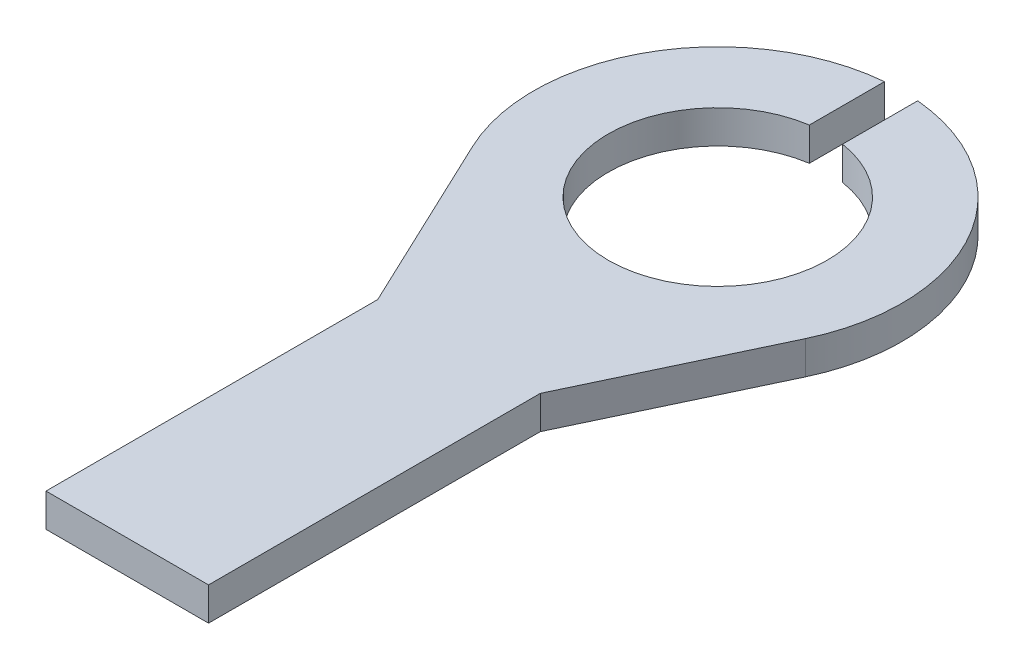
ISO-10303-21;
HEADER;
FILE_DESCRIPTION(('STEP AP214'),'2;1');
FILE_NAME('part.step','',(''),(''),'','','');
FILE_SCHEMA(('AUTOMOTIVE_DESIGN { 1 0 10303 214 1 1 1 1 }'));
ENDSEC;
DATA;
#1=APPLICATION_CONTEXT('core data for automotive mechanical design processes');
#2=APPLICATION_PROTOCOL_DEFINITION('international standard','automotive_design',2000,#1);
#3=PRODUCT_CONTEXT('',#1,'mechanical');
#4=PRODUCT('Part','Part','',(#3));
#5=PRODUCT_RELATED_PRODUCT_CATEGORY('part','',(#4));
#6=PRODUCT_DEFINITION_FORMATION('','',#4);
#7=PRODUCT_DEFINITION_CONTEXT('part definition',#1,'design');
#8=PRODUCT_DEFINITION('design','',#6,#7);
#9=PRODUCT_DEFINITION_SHAPE('','',#8);
#10=(LENGTH_UNIT() NAMED_UNIT(*) SI_UNIT(.MILLI.,.METRE.));
#11=(NAMED_UNIT(*) PLANE_ANGLE_UNIT() SI_UNIT($,.RADIAN.));
#12=(NAMED_UNIT(*) SI_UNIT($,.STERADIAN.) SOLID_ANGLE_UNIT());
#13=UNCERTAINTY_MEASURE_WITH_UNIT(LENGTH_MEASURE(1.E-05),#10,'distance_accuracy_value','');
#14=(GEOMETRIC_REPRESENTATION_CONTEXT(3) GLOBAL_UNCERTAINTY_ASSIGNED_CONTEXT((#13)) GLOBAL_UNIT_ASSIGNED_CONTEXT((#10,
#11,#12)) REPRESENTATION_CONTEXT('',''));
#15=CARTESIAN_POINT('',(0.,0.,0.));
#16=DIRECTION('',(0.,0.,1.));
#17=DIRECTION('',(1.,0.,0.));
#18=AXIS2_PLACEMENT_3D('',#15,#16,#17);
#19=CARTESIAN_POINT('',(-1.27432393723283,0.254,0.602787353048663));
#20=DIRECTION('',(0.903968175663497,0.,-0.427599739695441));
#21=DIRECTION('',(-0.427599739695441,0.,-0.903968175663497));
#22=AXIS2_PLACEMENT_3D('',#19,#20,#21);
#23=PLANE('',#22);
#24=DIRECTION('',(0.427599739695441,0.,0.903968175663497));
#25=VECTOR('',#24,1.);
#26=CARTESIAN_POINT('',(-1.27432393723283,0.,0.602787353048663));
#27=LINE('',#26,#25);
#28=CARTESIAN_POINT('',(-1.27432393723283,0.,0.602787353048662));
#29=VERTEX_POINT('',#28);
#30=CARTESIAN_POINT('',(-0.622300000000001,0.,1.9812));
#31=VERTEX_POINT('',#30);
#32=EDGE_CURVE('E140',#29,#31,#27,.T.);
#33=ORIENTED_EDGE('',*,*,#32,.T.);
#34=DIRECTION('',(0.,-1.,0.));
#35=VECTOR('',#34,1.);
#36=CARTESIAN_POINT('',(-0.622300000000001,0.254,1.9812));
#37=LINE('',#36,#35);
#38=CARTESIAN_POINT('',(-0.622300000000001,0.254,1.9812));
#39=VERTEX_POINT('',#38);
#40=EDGE_CURVE('E11',#39,#31,#37,.T.);
#41=ORIENTED_EDGE('',*,*,#40,.F.);
#42=DIRECTION('',(0.427599739695441,0.,0.903968175663497));
#43=VECTOR('',#42,1.);
#44=CARTESIAN_POINT('',(-1.27432393723283,0.254,0.602787353048663));
#45=LINE('',#44,#43);
#46=CARTESIAN_POINT('',(-1.27432393723283,0.254,0.602787353048662));
#47=VERTEX_POINT('',#46);
#48=EDGE_CURVE('E205',#47,#39,#45,.T.);
#49=ORIENTED_EDGE('',*,*,#48,.F.);
#50=DIRECTION('',(0.,-1.,0.));
#51=VECTOR('',#50,1.);
#52=CARTESIAN_POINT('',(-1.27432393723283,0.254,0.602787353048662));
#53=LINE('',#52,#51);
#54=EDGE_CURVE('E135',#47,#29,#53,.T.);
#55=ORIENTED_EDGE('',*,*,#54,.T.);
#56=EDGE_LOOP('',(#33,#41,#49,#55));
#57=FACE_BOUND('',#56,.T.);
#58=ADVANCED_FACE('F33',(#57),#23,.F.);
#59=CARTESIAN_POINT('',(-0.622300000000001,0.254,0.));
#60=DIRECTION('',(1.,0.,0.));
#61=DIRECTION('',(0.,0.,-1.));
#62=AXIS2_PLACEMENT_3D('',#59,#60,#61);
#63=PLANE('',#62);
#64=DIRECTION('',(0.,0.,1.));
#65=VECTOR('',#64,1.);
#66=CARTESIAN_POINT('',(-0.622300000000001,0.,0.));
#67=LINE('',#66,#65);
#68=CARTESIAN_POINT('',(-0.6223,0.,4.5212));
#69=VERTEX_POINT('',#68);
#70=EDGE_CURVE('E143',#31,#69,#67,.T.);
#71=ORIENTED_EDGE('',*,*,#70,.T.);
#72=DIRECTION('',(0.,-1.,0.));
#73=VECTOR('',#72,1.);
#74=CARTESIAN_POINT('',(-0.6223,0.254,4.5212));
#75=LINE('',#74,#73);
#76=CARTESIAN_POINT('',(-0.6223,0.254,4.5212));
#77=VERTEX_POINT('',#76);
#78=EDGE_CURVE('E41',#77,#69,#75,.T.);
#79=ORIENTED_EDGE('',*,*,#78,.F.);
#80=DIRECTION('',(0.,0.,1.));
#81=VECTOR('',#80,1.);
#82=CARTESIAN_POINT('',(-0.622300000000001,0.254,0.));
#83=LINE('',#82,#81);
#84=EDGE_CURVE('E94',#39,#77,#83,.T.);
#85=ORIENTED_EDGE('',*,*,#84,.F.);
#86=ORIENTED_EDGE('',*,*,#40,.T.);
#87=EDGE_LOOP('',(#71,#79,#85,#86));
#88=FACE_BOUND('',#87,.T.);
#89=ADVANCED_FACE('F210',(#88),#63,.F.);
#90=CARTESIAN_POINT('',(0.,0.254,4.5212));
#91=DIRECTION('',(0.,0.,-1.));
#92=DIRECTION('',(-1.,0.,0.));
#93=AXIS2_PLACEMENT_3D('',#90,#91,#92);
#94=PLANE('',#93);
#95=DIRECTION('',(1.,0.,0.));
#96=VECTOR('',#95,1.);
#97=CARTESIAN_POINT('',(0.,0.,4.5212));
#98=LINE('',#97,#96);
#99=CARTESIAN_POINT('',(0.6223,0.,4.5212));
#100=VERTEX_POINT('',#99);
#101=EDGE_CURVE('E145',#69,#100,#98,.T.);
#102=ORIENTED_EDGE('',*,*,#101,.T.);
#103=DIRECTION('',(0.,-1.,0.));
#104=VECTOR('',#103,1.);
#105=CARTESIAN_POINT('',(0.6223,0.254,4.5212));
#106=LINE('',#105,#104);
#107=CARTESIAN_POINT('',(0.6223,0.254,4.5212));
#108=VERTEX_POINT('',#107);
#109=EDGE_CURVE('E171',#108,#100,#106,.T.);
#110=ORIENTED_EDGE('',*,*,#109,.F.);
#111=DIRECTION('',(1.,0.,0.));
#112=VECTOR('',#111,1.);
#113=CARTESIAN_POINT('',(0.,0.254,4.5212));
#114=LINE('',#113,#112);
#115=EDGE_CURVE('E179',#77,#108,#114,.T.);
#116=ORIENTED_EDGE('',*,*,#115,.F.);
#117=ORIENTED_EDGE('',*,*,#78,.T.);
#118=EDGE_LOOP('',(#102,#110,#116,#117));
#119=FACE_BOUND('',#118,.T.);
#120=ADVANCED_FACE('F177',(#119),#94,.F.);
#121=CARTESIAN_POINT('',(0.622300000000001,0.254,0.));
#122=DIRECTION('',(-1.,0.,0.));
#123=DIRECTION('',(0.,0.,1.));
#124=AXIS2_PLACEMENT_3D('',#121,#122,#123);
#125=PLANE('',#124);
#126=DIRECTION('',(0.,0.,-1.));
#127=VECTOR('',#126,1.);
#128=CARTESIAN_POINT('',(0.622300000000001,0.,0.));
#129=LINE('',#128,#127);
#130=CARTESIAN_POINT('',(0.6223,0.,1.9812));
#131=VERTEX_POINT('',#130);
#132=EDGE_CURVE('E147',#100,#131,#129,.T.);
#133=ORIENTED_EDGE('',*,*,#132,.T.);
#134=DIRECTION('',(0.,-1.,0.));
#135=VECTOR('',#134,1.);
#136=CARTESIAN_POINT('',(0.6223,0.254,1.9812));
#137=LINE('',#136,#135);
#138=CARTESIAN_POINT('',(0.6223,0.254,1.9812));
#139=VERTEX_POINT('',#138);
#140=EDGE_CURVE('E169',#139,#131,#137,.T.);
#141=ORIENTED_EDGE('',*,*,#140,.F.);
#142=DIRECTION('',(0.,0.,-1.));
#143=VECTOR('',#142,1.);
#144=CARTESIAN_POINT('',(0.622300000000001,0.254,0.));
#145=LINE('',#144,#143);
#146=EDGE_CURVE('E191',#108,#139,#145,.T.);
#147=ORIENTED_EDGE('',*,*,#146,.F.);
#148=ORIENTED_EDGE('',*,*,#109,.T.);
#149=EDGE_LOOP('',(#133,#141,#147,#148));
#150=FACE_BOUND('',#149,.T.);
#151=ADVANCED_FACE('F188',(#150),#125,.F.);
#152=CARTESIAN_POINT('',(1.27432393723283,0.254,0.602787353048661));
#153=DIRECTION('',(0.903968175663498,0.,0.42759973969544));
#154=DIRECTION('',(0.42759973969544,0.,-0.903968175663498));
#155=AXIS2_PLACEMENT_3D('',#152,#153,#154);
#156=PLANE('',#155);
#157=DIRECTION('',(-0.42759973969544,0.,0.903968175663498));
#158=VECTOR('',#157,1.);
#159=CARTESIAN_POINT('',(1.27432393723283,0.,0.602787353048661));
#160=LINE('',#159,#158);
#161=CARTESIAN_POINT('',(1.27432393723283,0.,0.602787353048662));
#162=VERTEX_POINT('',#161);
#163=EDGE_CURVE('E150',#162,#131,#160,.T.);
#164=ORIENTED_EDGE('',*,*,#163,.F.);
#165=DIRECTION('',(0.,-1.,0.));
#166=VECTOR('',#165,1.);
#167=CARTESIAN_POINT('',(1.27432393723283,0.254,0.602787353048662));
#168=LINE('',#167,#166);
#169=CARTESIAN_POINT('',(1.27432393723283,0.254,0.602787353048662));
#170=VERTEX_POINT('',#169);
#171=EDGE_CURVE('E167',#170,#162,#168,.T.);
#172=ORIENTED_EDGE('',*,*,#171,.F.);
#173=DIRECTION('',(-0.42759973969544,0.,0.903968175663498));
#174=VECTOR('',#173,1.);
#175=CARTESIAN_POINT('',(1.27432393723283,0.254,0.602787353048661));
#176=LINE('',#175,#174);
#177=EDGE_CURVE('E193',#170,#139,#176,.T.);
#178=ORIENTED_EDGE('',*,*,#177,.T.);
#179=ORIENTED_EDGE('',*,*,#140,.T.);
#180=EDGE_LOOP('',(#164,#172,#178,#179));
#181=FACE_BOUND('',#180,.T.);
#182=ADVANCED_FACE('F220',(#181),#156,.T.);
#183=CARTESIAN_POINT('',(0.,0.254,0.));
#184=DIRECTION('',(0.,-1.,0.));
#185=DIRECTION('',(0.,0.,-1.));
#186=AXIS2_PLACEMENT_3D('',#183,#184,#185);
#187=CYLINDRICAL_SURFACE('',#186,1.4097);
#188=CARTESIAN_POINT('',(0.,0.,0.));
#189=DIRECTION('',(0.,1.,0.));
#190=DIRECTION('',(0.,0.,1.));
#191=AXIS2_PLACEMENT_3D('',#188,#189,#190);
#192=CIRCLE('',#191,1.4097);
#193=CARTESIAN_POINT('',(0.127,0.,-1.40396762427059));
#194=VERTEX_POINT('',#193);
#195=EDGE_CURVE('E153',#162,#194,#192,.T.);
#196=ORIENTED_EDGE('',*,*,#195,.T.);
#197=DIRECTION('',(0.,-1.,0.));
#198=VECTOR('',#197,1.);
#199=CARTESIAN_POINT('',(0.127,0.254,-1.40396762427059));
#200=LINE('',#199,#198);
#201=CARTESIAN_POINT('',(0.127,0.254,-1.40396762427059));
#202=VERTEX_POINT('',#201);
#203=EDGE_CURVE('E164',#202,#194,#200,.T.);
#204=ORIENTED_EDGE('',*,*,#203,.F.);
#205=CARTESIAN_POINT('',(0.,0.254,0.));
#206=DIRECTION('',(0.,1.,0.));
#207=DIRECTION('',(0.,0.,1.));
#208=AXIS2_PLACEMENT_3D('',#205,#206,#207);
#209=CIRCLE('',#208,1.4097);
#210=EDGE_CURVE('E137',#170,#202,#209,.T.);
#211=ORIENTED_EDGE('',*,*,#210,.F.);
#212=ORIENTED_EDGE('',*,*,#171,.T.);
#213=EDGE_LOOP('',(#196,#204,#211,#212));
#214=FACE_BOUND('',#213,.T.);
#215=ADVANCED_FACE('F201',(#214),#187,.T.);
#216=CARTESIAN_POINT('',(0.127,0.254,0.));
#217=DIRECTION('',(1.,0.,0.));
#218=DIRECTION('',(0.,0.,-1.));
#219=AXIS2_PLACEMENT_3D('',#216,#217,#218);
#220=PLANE('',#219);
#221=DIRECTION('',(0.,0.,1.));
#222=VECTOR('',#221,1.);
#223=CARTESIAN_POINT('',(0.127,0.,0.));
#224=LINE('',#223,#222);
#225=CARTESIAN_POINT('',(0.127,0.,-0.828522926659245));
#226=VERTEX_POINT('',#225);
#227=EDGE_CURVE('E155',#194,#226,#224,.T.);
#228=ORIENTED_EDGE('',*,*,#227,.T.);
#229=DIRECTION('',(0.,-1.,0.));
#230=VECTOR('',#229,1.);
#231=CARTESIAN_POINT('',(0.127,0.254,-0.828522926659245));
#232=LINE('',#231,#230);
#233=CARTESIAN_POINT('',(0.127,0.254,-0.828522926659245));
#234=VERTEX_POINT('',#233);
#235=EDGE_CURVE('E125',#234,#226,#232,.T.);
#236=ORIENTED_EDGE('',*,*,#235,.F.);
#237=DIRECTION('',(0.,0.,1.));
#238=VECTOR('',#237,1.);
#239=CARTESIAN_POINT('',(0.127,0.254,0.));
#240=LINE('',#239,#238);
#241=EDGE_CURVE('E130',#202,#234,#240,.T.);
#242=ORIENTED_EDGE('',*,*,#241,.F.);
#243=ORIENTED_EDGE('',*,*,#203,.T.);
#244=EDGE_LOOP('',(#228,#236,#242,#243));
#245=FACE_BOUND('',#244,.T.);
#246=ADVANCED_FACE('F204',(#245),#220,.F.);
#247=CARTESIAN_POINT('',(0.,0.254,0.));
#248=DIRECTION('',(0.,-1.,0.));
#249=DIRECTION('',(0.,0.,-1.));
#250=AXIS2_PLACEMENT_3D('',#247,#248,#249);
#251=CYLINDRICAL_SURFACE('',#250,0.8382);
#252=CARTESIAN_POINT('',(0.,0.,0.));
#253=DIRECTION('',(0.,1.,0.));
#254=DIRECTION('',(0.,0.,1.));
#255=AXIS2_PLACEMENT_3D('',#252,#253,#254);
#256=CIRCLE('',#255,0.8382);
#257=CARTESIAN_POINT('',(-0.127,0.,-0.828522926659245));
#258=VERTEX_POINT('',#257);
#259=EDGE_CURVE('E120',#258,#226,#256,.T.);
#260=ORIENTED_EDGE('',*,*,#259,.F.);
#261=DIRECTION('',(0.,-1.,0.));
#262=VECTOR('',#261,1.);
#263=CARTESIAN_POINT('',(-0.127,0.254,-0.828522926659245));
#264=LINE('',#263,#262);
#265=CARTESIAN_POINT('',(-0.127,0.254,-0.828522926659245));
#266=VERTEX_POINT('',#265);
#267=EDGE_CURVE('E115',#266,#258,#264,.T.);
#268=ORIENTED_EDGE('',*,*,#267,.F.);
#269=CARTESIAN_POINT('',(0.,0.254,0.));
#270=DIRECTION('',(0.,1.,0.));
#271=DIRECTION('',(0.,0.,1.));
#272=AXIS2_PLACEMENT_3D('',#269,#270,#271);
#273=CIRCLE('',#272,0.8382);
#274=EDGE_CURVE('E118',#266,#234,#273,.T.);
#275=ORIENTED_EDGE('',*,*,#274,.T.);
#276=ORIENTED_EDGE('',*,*,#235,.T.);
#277=EDGE_LOOP('',(#260,#268,#275,#276));
#278=FACE_BOUND('',#277,.T.);
#279=ADVANCED_FACE('F117',(#278),#251,.F.);
#280=CARTESIAN_POINT('',(-0.126999999999998,0.254,0.));
#281=DIRECTION('',(1.,0.,0.));
#282=DIRECTION('',(0.,0.,-1.));
#283=AXIS2_PLACEMENT_3D('',#280,#281,#282);
#284=PLANE('',#283);
#285=DIRECTION('',(0.,0.,1.));
#286=VECTOR('',#285,1.);
#287=CARTESIAN_POINT('',(-0.126999999999998,0.,0.));
#288=LINE('',#287,#286);
#289=CARTESIAN_POINT('',(-0.127000000000001,0.,-1.40396762427059));
#290=VERTEX_POINT('',#289);
#291=EDGE_CURVE('E159',#290,#258,#288,.T.);
#292=ORIENTED_EDGE('',*,*,#291,.F.);
#293=DIRECTION('',(0.,-1.,0.));
#294=VECTOR('',#293,1.);
#295=CARTESIAN_POINT('',(-0.127000000000001,0.254,-1.40396762427059));
#296=LINE('',#295,#294);
#297=CARTESIAN_POINT('',(-0.127000000000001,0.254,-1.40396762427059));
#298=VERTEX_POINT('',#297);
#299=EDGE_CURVE('E83',#298,#290,#296,.T.);
#300=ORIENTED_EDGE('',*,*,#299,.F.);
#301=DIRECTION('',(0.,0.,1.));
#302=VECTOR('',#301,1.);
#303=CARTESIAN_POINT('',(-0.126999999999998,0.254,0.));
#304=LINE('',#303,#302);
#305=EDGE_CURVE('E128',#298,#266,#304,.T.);
#306=ORIENTED_EDGE('',*,*,#305,.T.);
#307=ORIENTED_EDGE('',*,*,#267,.T.);
#308=EDGE_LOOP('',(#292,#300,#306,#307));
#309=FACE_BOUND('',#308,.T.);
#310=ADVANCED_FACE('F133',(#309),#284,.T.);
#311=EDGE_CURVE('E86',#290,#29,#192,.T.);
#312=ORIENTED_EDGE('',*,*,#311,.T.);
#313=ORIENTED_EDGE('',*,*,#54,.F.);
#314=EDGE_CURVE('E49',#298,#47,#209,.T.);
#315=ORIENTED_EDGE('',*,*,#314,.F.);
#316=ORIENTED_EDGE('',*,*,#299,.T.);
#317=EDGE_LOOP('',(#312,#313,#315,#316));
#318=FACE_BOUND('',#317,.T.);
#319=ADVANCED_FACE('F230',(#318),#187,.T.);
#320=CARTESIAN_POINT('',(0.,0.254,0.));
#321=DIRECTION('',(0.,1.,0.));
#322=DIRECTION('',(0.,0.,1.));
#323=AXIS2_PLACEMENT_3D('',#320,#321,#322);
#324=PLANE('',#323);
#325=ORIENTED_EDGE('',*,*,#48,.T.);
#326=ORIENTED_EDGE('',*,*,#84,.T.);
#327=ORIENTED_EDGE('',*,*,#115,.T.);
#328=ORIENTED_EDGE('',*,*,#146,.T.);
#329=ORIENTED_EDGE('',*,*,#177,.F.);
#330=ORIENTED_EDGE('',*,*,#210,.T.);
#331=ORIENTED_EDGE('',*,*,#241,.T.);
#332=ORIENTED_EDGE('',*,*,#274,.F.);
#333=ORIENTED_EDGE('',*,*,#305,.F.);
#334=ORIENTED_EDGE('',*,*,#314,.T.);
#335=EDGE_LOOP('',(#325,#326,#327,#328,#329,#330,#331,#332,#333,#334));
#336=FACE_BOUND('',#335,.T.);
#337=ADVANCED_FACE('F127',(#336),#324,.T.);
#338=CARTESIAN_POINT('',(0.,0.,0.));
#339=DIRECTION('',(0.,1.,0.));
#340=DIRECTION('',(0.,0.,1.));
#341=AXIS2_PLACEMENT_3D('',#338,#339,#340);
#342=PLANE('',#341);
#343=ORIENTED_EDGE('',*,*,#32,.F.);
#344=ORIENTED_EDGE('',*,*,#311,.F.);
#345=ORIENTED_EDGE('',*,*,#291,.T.);
#346=ORIENTED_EDGE('',*,*,#259,.T.);
#347=ORIENTED_EDGE('',*,*,#227,.F.);
#348=ORIENTED_EDGE('',*,*,#195,.F.);
#349=ORIENTED_EDGE('',*,*,#163,.T.);
#350=ORIENTED_EDGE('',*,*,#132,.F.);
#351=ORIENTED_EDGE('',*,*,#101,.F.);
#352=ORIENTED_EDGE('',*,*,#70,.F.);
#353=EDGE_LOOP('',(#343,#344,#345,#346,#347,#348,#349,#350,#351,#352));
#354=FACE_BOUND('',#353,.T.);
#355=ADVANCED_FACE('F183',(#354),#342,.F.);
#356=CLOSED_SHELL('',(#58,#89,#120,#151,#182,#215,#246,#279,#310,#319,#337,#355));
#357=MANIFOLD_SOLID_BREP('B2',#356);
#358=ADVANCED_BREP_SHAPE_REPRESENTATION('',(#18,#357),#14);
#359=SHAPE_DEFINITION_REPRESENTATION(#9,#358);
ENDSEC;
END-ISO-10303-21;
